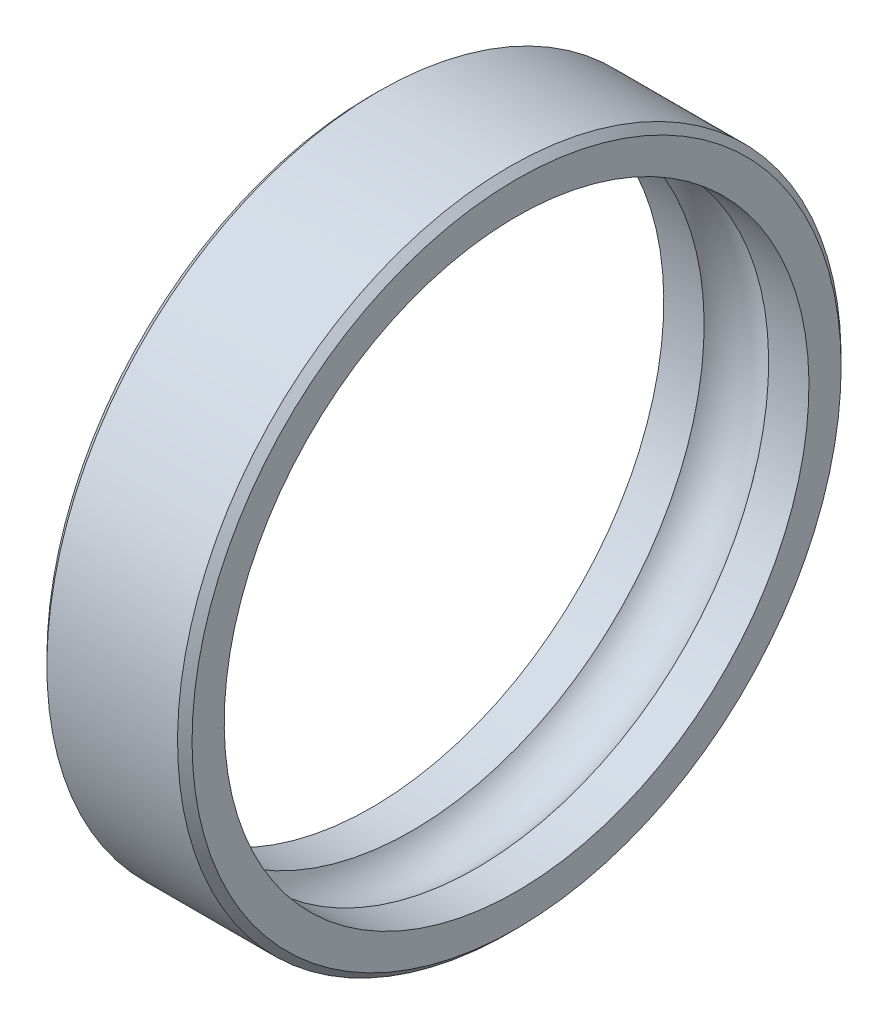
ISO-10303-21;
HEADER;
FILE_DESCRIPTION(('STEP AP214'),'2;1');
FILE_NAME('part.step','',(''),(''),'','','');
FILE_SCHEMA(('AUTOMOTIVE_DESIGN { 1 0 10303 214 1 1 1 1 }'));
ENDSEC;
DATA;
#1=APPLICATION_CONTEXT('core data for automotive mechanical design processes');
#2=APPLICATION_PROTOCOL_DEFINITION('international standard','automotive_design',2000,#1);
#3=PRODUCT_CONTEXT('',#1,'mechanical');
#4=PRODUCT('Part','Part','',(#3));
#5=PRODUCT_RELATED_PRODUCT_CATEGORY('part','',(#4));
#6=PRODUCT_DEFINITION_FORMATION('','',#4);
#7=PRODUCT_DEFINITION_CONTEXT('part definition',#1,'design');
#8=PRODUCT_DEFINITION('design','',#6,#7);
#9=PRODUCT_DEFINITION_SHAPE('','',#8);
#10=(LENGTH_UNIT() NAMED_UNIT(*) SI_UNIT(.MILLI.,.METRE.));
#11=(NAMED_UNIT(*) PLANE_ANGLE_UNIT() SI_UNIT($,.RADIAN.));
#12=(NAMED_UNIT(*) SI_UNIT($,.STERADIAN.) SOLID_ANGLE_UNIT());
#13=UNCERTAINTY_MEASURE_WITH_UNIT(LENGTH_MEASURE(1.E-05),#10,'distance_accuracy_value','');
#14=(GEOMETRIC_REPRESENTATION_CONTEXT(3) GLOBAL_UNCERTAINTY_ASSIGNED_CONTEXT((#13)) GLOBAL_UNIT_ASSIGNED_CONTEXT((#10,
#11,#12)) REPRESENTATION_CONTEXT('',''));
#15=CARTESIAN_POINT('',(0.,0.,0.));
#16=DIRECTION('',(0.,0.,1.));
#17=DIRECTION('',(1.,0.,0.));
#18=AXIS2_PLACEMENT_3D('',#15,#16,#17);
#19=CARTESIAN_POINT('',(8.025,0.,0.));
#20=DIRECTION('',(1.,0.,0.));
#21=DIRECTION('',(0.,0.963910606013732,-0.266226113697059));
#22=AXIS2_PLACEMENT_3D('',#19,#20,#21);
#23=CYLINDRICAL_SURFACE('',#22,14.0989010989011);
#24=CARTESIAN_POINT('',(6.08055555555556,0.,0.));
#25=DIRECTION('',(1.,0.,0.));
#26=DIRECTION('',(0.,0.963910606013732,-0.266226113697059));
#27=AXIS2_PLACEMENT_3D('',#24,#25,#26);
#28=CIRCLE('',#27,14.0989010989011);
#29=CARTESIAN_POINT('',(6.08055555555556,13.5900803023694,-3.75349564695963));
#30=VERTEX_POINT('',#29);
#31=EDGE_CURVE('E10',#30,#30,#28,.T.);
#32=ORIENTED_EDGE('',*,*,#31,.F.);
#33=EDGE_LOOP('',(#32));
#34=FACE_BOUND('',#33,.T.);
#35=CARTESIAN_POINT('',(8.025,0.,0.));
#36=DIRECTION('',(1.,0.,0.));
#37=DIRECTION('',(0.,0.963910606013732,-0.266226113697059));
#38=AXIS2_PLACEMENT_3D('',#35,#36,#37);
#39=CIRCLE('',#38,14.0989010989011);
#40=CARTESIAN_POINT('',(8.025,13.5900803023694,-3.75349564695963));
#41=VERTEX_POINT('',#40);
#42=EDGE_CURVE('E52',#41,#41,#39,.T.);
#43=ORIENTED_EDGE('',*,*,#42,.T.);
#44=EDGE_LOOP('',(#43));
#45=FACE_BOUND('',#44,.T.);
#46=ADVANCED_FACE('F15',(#34,#45),#23,.F.);
#47=CARTESIAN_POINT('',(4.525,0.,0.));
#48=DIRECTION('',(1.,0.,0.));
#49=DIRECTION('',(0.,0.963910606013732,-0.266226113697059));
#50=AXIS2_PLACEMENT_3D('',#47,#48,#49);
#51=TOROIDAL_SURFACE('',#50,13.,1.90455682813241);
#52=CARTESIAN_POINT('',(2.96944444444445,0.,0.));
#53=DIRECTION('',(1.,0.,0.));
#54=DIRECTION('',(0.,0.963910606013732,-0.266226113697059));
#55=AXIS2_PLACEMENT_3D('',#52,#53,#54);
#56=CIRCLE('',#55,14.0989010989011);
#57=CARTESIAN_POINT('',(2.96944444444445,13.5900803023694,-3.75349564695963));
#58=VERTEX_POINT('',#57);
#59=EDGE_CURVE('E22',#58,#58,#56,.T.);
#60=ORIENTED_EDGE('',*,*,#59,.F.);
#61=EDGE_LOOP('',(#60));
#62=FACE_BOUND('',#61,.T.);
#63=ORIENTED_EDGE('',*,*,#31,.T.);
#64=EDGE_LOOP('',(#63));
#65=FACE_BOUND('',#64,.T.);
#66=ADVANCED_FACE('F86',(#62,#65),#51,.F.);
#67=CARTESIAN_POINT('',(8.025,0.,0.));
#68=DIRECTION('',(1.,0.,0.));
#69=DIRECTION('',(0.,0.963910606013732,-0.266226113697059));
#70=AXIS2_PLACEMENT_3D('',#67,#68,#69);
#71=CYLINDRICAL_SURFACE('',#70,14.0989010989011);
#72=CARTESIAN_POINT('',(1.025,0.,0.));
#73=DIRECTION('',(1.,0.,0.));
#74=DIRECTION('',(0.,0.963910606013732,-0.266226113697059));
#75=AXIS2_PLACEMENT_3D('',#72,#73,#74);
#76=CIRCLE('',#75,14.0989010989011);
#77=CARTESIAN_POINT('',(1.025,13.5900803023694,-3.75349564695963));
#78=VERTEX_POINT('',#77);
#79=EDGE_CURVE('E48',#78,#78,#76,.T.);
#80=ORIENTED_EDGE('',*,*,#79,.F.);
#81=EDGE_LOOP('',(#80));
#82=FACE_BOUND('',#81,.T.);
#83=ORIENTED_EDGE('',*,*,#59,.T.);
#84=EDGE_LOOP('',(#83));
#85=FACE_BOUND('',#84,.T.);
#86=ADVANCED_FACE('F81',(#82,#85),#71,.F.);
#87=CARTESIAN_POINT('',(1.025,0.,0.));
#88=DIRECTION('',(1.,0.,0.));
#89=DIRECTION('',(0.,0.963910606013732,-0.266226113697059));
#90=AXIS2_PLACEMENT_3D('',#87,#88,#89);
#91=CONICAL_SURFACE('',#90,15.65,0.785398163397446);
#92=CARTESIAN_POINT('',(1.025,0.,0.));
#93=DIRECTION('',(1.,0.,0.));
#94=DIRECTION('',(0.,0.963910606013732,-0.266226113697059));
#95=AXIS2_PLACEMENT_3D('',#92,#93,#94);
#96=CIRCLE('',#95,15.65);
#97=CARTESIAN_POINT('',(1.025,15.0852009841149,-4.16643867935897));
#98=VERTEX_POINT('',#97);
#99=EDGE_CURVE('E43',#98,#98,#96,.T.);
#100=ORIENTED_EDGE('',*,*,#99,.T.);
#101=EDGE_LOOP('',(#100));
#102=FACE_BOUND('',#101,.T.);
#103=CARTESIAN_POINT('',(1.375,0.,0.));
#104=DIRECTION('',(1.,0.,0.));
#105=DIRECTION('',(0.,0.963910606013732,-0.266226113697059));
#106=AXIS2_PLACEMENT_3D('',#103,#104,#105);
#107=CIRCLE('',#106,16.);
#108=CARTESIAN_POINT('',(1.375,15.4225696962197,-4.25961781915294));
#109=VERTEX_POINT('',#108);
#110=EDGE_CURVE('E31',#109,#109,#107,.T.);
#111=ORIENTED_EDGE('',*,*,#110,.F.);
#112=EDGE_LOOP('',(#111));
#113=FACE_BOUND('',#112,.T.);
#114=ADVANCED_FACE('F74',(#102,#113),#91,.T.);
#115=CARTESIAN_POINT('',(8.025,0.,0.));
#116=DIRECTION('',(1.,0.,0.));
#117=DIRECTION('',(0.,0.963910606013732,-0.266226113697059));
#118=AXIS2_PLACEMENT_3D('',#115,#116,#117);
#119=CYLINDRICAL_SURFACE('',#118,16.);
#120=ORIENTED_EDGE('',*,*,#110,.T.);
#121=EDGE_LOOP('',(#120));
#122=FACE_BOUND('',#121,.T.);
#123=CARTESIAN_POINT('',(7.675,0.,0.));
#124=DIRECTION('',(1.,0.,0.));
#125=DIRECTION('',(0.,0.963910606013732,-0.266226113697059));
#126=AXIS2_PLACEMENT_3D('',#123,#124,#125);
#127=CIRCLE('',#126,16.);
#128=CARTESIAN_POINT('',(7.675,15.4225696962197,-4.25961781915294));
#129=VERTEX_POINT('',#128);
#130=EDGE_CURVE('E38',#129,#129,#127,.T.);
#131=ORIENTED_EDGE('',*,*,#130,.F.);
#132=EDGE_LOOP('',(#131));
#133=FACE_BOUND('',#132,.T.);
#134=ADVANCED_FACE('F69',(#122,#133),#119,.T.);
#135=CARTESIAN_POINT('',(7.675,0.,0.));
#136=DIRECTION('',(-1.,0.,0.));
#137=DIRECTION('',(0.,-0.963910606013732,0.266226113697059));
#138=AXIS2_PLACEMENT_3D('',#135,#136,#137);
#139=CONICAL_SURFACE('',#138,16.,0.785398163397448);
#140=CARTESIAN_POINT('',(8.025,0.,0.));
#141=DIRECTION('',(1.,0.,0.));
#142=DIRECTION('',(0.,0.963910606013732,-0.266226113697059));
#143=AXIS2_PLACEMENT_3D('',#140,#141,#142);
#144=CIRCLE('',#143,15.65);
#145=CARTESIAN_POINT('',(8.025,15.0852009841149,-4.16643867935897));
#146=VERTEX_POINT('',#145);
#147=EDGE_CURVE('E56',#146,#146,#144,.T.);
#148=ORIENTED_EDGE('',*,*,#147,.F.);
#149=EDGE_LOOP('',(#148));
#150=FACE_BOUND('',#149,.T.);
#151=ORIENTED_EDGE('',*,*,#130,.T.);
#152=EDGE_LOOP('',(#151));
#153=FACE_BOUND('',#152,.T.);
#154=ADVANCED_FACE('F65',(#150,#153),#139,.T.);
#155=CARTESIAN_POINT('',(1.025,4.16643867935896,15.0852009841149));
#156=DIRECTION('',(1.,0.,0.));
#157=DIRECTION('',(0.,0.,1.));
#158=AXIS2_PLACEMENT_3D('',#155,#156,#157);
#159=PLANE('',#158);
#160=ORIENTED_EDGE('',*,*,#99,.F.);
#161=EDGE_LOOP('',(#160));
#162=FACE_BOUND('',#161,.T.);
#163=ORIENTED_EDGE('',*,*,#79,.T.);
#164=EDGE_LOOP('',(#163));
#165=FACE_BOUND('',#164,.T.);
#166=ADVANCED_FACE('F68',(#162,#165),#159,.F.);
#167=CARTESIAN_POINT('',(8.025,4.16643867935896,15.0852009841149));
#168=DIRECTION('',(-1.,0.,0.));
#169=DIRECTION('',(0.,0.,1.));
#170=AXIS2_PLACEMENT_3D('',#167,#168,#169);
#171=PLANE('',#170);
#172=ORIENTED_EDGE('',*,*,#42,.F.);
#173=EDGE_LOOP('',(#172));
#174=FACE_BOUND('',#173,.T.);
#175=ORIENTED_EDGE('',*,*,#147,.T.);
#176=EDGE_LOOP('',(#175));
#177=FACE_BOUND('',#176,.T.);
#178=ADVANCED_FACE('F63',(#174,#177),#171,.F.);
#179=CLOSED_SHELL('',(#46,#66,#86,#114,#134,#154,#166,#178));
#180=MANIFOLD_SOLID_BREP('B1',#179);
#181=ADVANCED_BREP_SHAPE_REPRESENTATION('',(#18,#180),#14);
#182=SHAPE_DEFINITION_REPRESENTATION(#9,#181);
ENDSEC;
END-ISO-10303-21;
